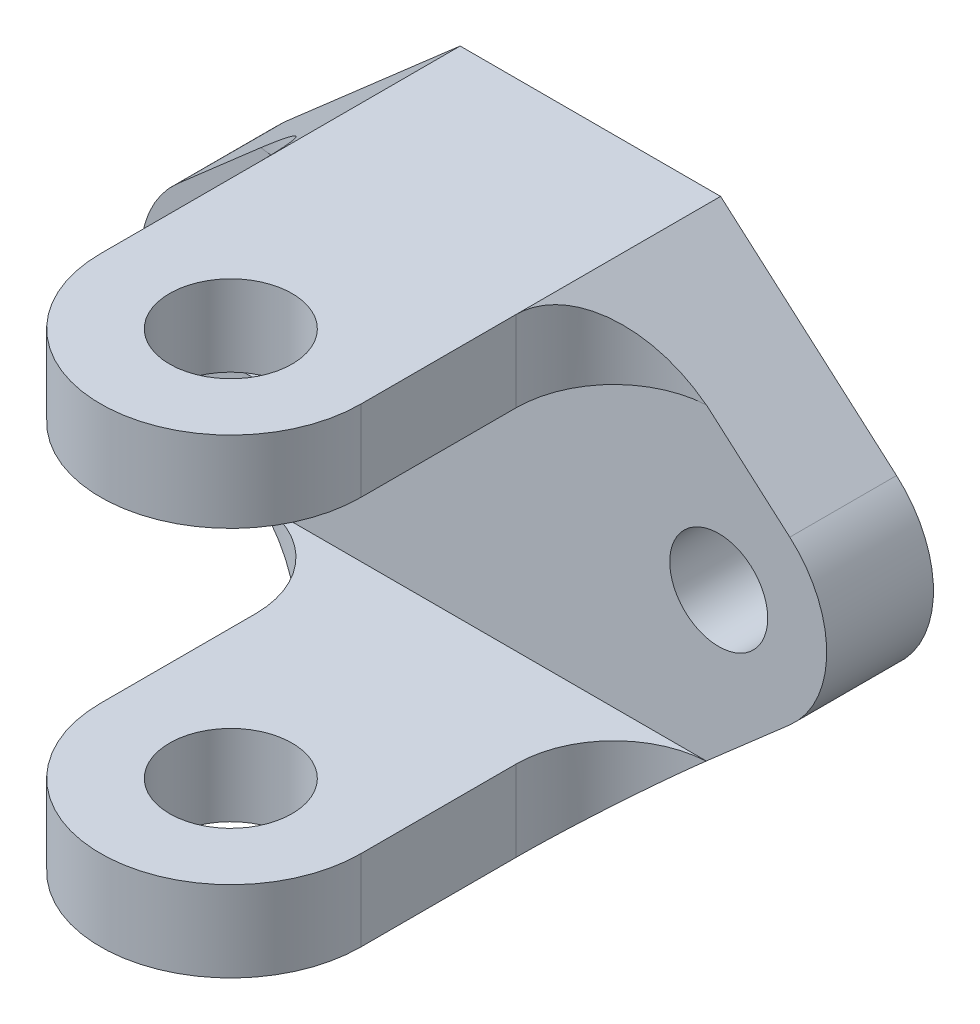
ISO-10303-21;
HEADER;
FILE_DESCRIPTION(('STEP AP214'),'2;1');
FILE_NAME('part.step','',(''),(''),'','','');
FILE_SCHEMA(('AUTOMOTIVE_DESIGN { 1 0 10303 214 1 1 1 1 }'));
ENDSEC;
DATA;
#1=APPLICATION_CONTEXT('core data for automotive mechanical design processes');
#2=APPLICATION_PROTOCOL_DEFINITION('international standard','automotive_design',2000,#1);
#3=PRODUCT_CONTEXT('',#1,'mechanical');
#4=PRODUCT('Part','Part','',(#3));
#5=PRODUCT_RELATED_PRODUCT_CATEGORY('part','',(#4));
#6=PRODUCT_DEFINITION_FORMATION('','',#4);
#7=PRODUCT_DEFINITION_CONTEXT('part definition',#1,'design');
#8=PRODUCT_DEFINITION('design','',#6,#7);
#9=PRODUCT_DEFINITION_SHAPE('','',#8);
#10=(LENGTH_UNIT() NAMED_UNIT(*) SI_UNIT(.MILLI.,.METRE.));
#11=(NAMED_UNIT(*) PLANE_ANGLE_UNIT() SI_UNIT($,.RADIAN.));
#12=(NAMED_UNIT(*) SI_UNIT($,.STERADIAN.) SOLID_ANGLE_UNIT());
#13=UNCERTAINTY_MEASURE_WITH_UNIT(LENGTH_MEASURE(1.E-05),#10,'distance_accuracy_value','');
#14=(GEOMETRIC_REPRESENTATION_CONTEXT(3) GLOBAL_UNCERTAINTY_ASSIGNED_CONTEXT((#13)) GLOBAL_UNIT_ASSIGNED_CONTEXT((#10,
#11,#12)) REPRESENTATION_CONTEXT('',''));
#15=CARTESIAN_POINT('',(0.,0.,0.));
#16=DIRECTION('',(0.,0.,1.));
#17=DIRECTION('',(1.,0.,0.));
#18=AXIS2_PLACEMENT_3D('',#15,#16,#17);
#19=CARTESIAN_POINT('',(-8.4418692,-85.7339032824825,0.));
#20=DIRECTION('',(1.,0.,0.));
#21=DIRECTION('',(0.,0.,-1.));
#22=AXIS2_PLACEMENT_3D('',#19,#20,#21);
#23=PLANE('',#22);
#24=DIRECTION('',(0.,0.,1.));
#25=VECTOR('',#24,1.);
#26=CARTESIAN_POINT('',(-8.4418692,15.24,0.));
#27=LINE('',#26,#25);
#28=CARTESIAN_POINT('',(-8.4418692,15.24,15.81));
#29=VERTEX_POINT('',#28);
#30=CARTESIAN_POINT('',(-8.4418692,15.24,25.8481308));
#31=VERTEX_POINT('',#30);
#32=EDGE_CURVE('E194',#29,#31,#27,.T.);
#33=ORIENTED_EDGE('',*,*,#32,.F.);
#34=DIRECTION('',(0.,1.,0.));
#35=VECTOR('',#34,1.);
#36=CARTESIAN_POINT('',(-8.4418692,9.99999999999999,15.81));
#37=LINE('',#36,#35);
#38=CARTESIAN_POINT('',(-8.4418692,10.,15.81));
#39=VERTEX_POINT('',#38);
#40=EDGE_CURVE('E285',#29,#39,#37,.F.);
#41=ORIENTED_EDGE('',*,*,#40,.T.);
#42=DIRECTION('',(0.,0.,-1.));
#43=VECTOR('',#42,1.);
#44=CARTESIAN_POINT('',(-8.4418692,10.,62.46));
#45=LINE('',#44,#43);
#46=CARTESIAN_POINT('',(-8.4418692,9.99999999999999,25.8481308));
#47=VERTEX_POINT('',#46);
#48=EDGE_CURVE('E230',#47,#39,#45,.T.);
#49=ORIENTED_EDGE('',*,*,#48,.F.);
#50=DIRECTION('',(0.,1.,0.));
#51=VECTOR('',#50,1.);
#52=CARTESIAN_POINT('',(-8.4418692,-85.7339032824825,25.8481308));
#53=LINE('',#52,#51);
#54=EDGE_CURVE('E208',#47,#31,#53,.T.);
#55=ORIENTED_EDGE('',*,*,#54,.T.);
#56=EDGE_LOOP('',(#33,#41,#49,#55));
#57=FACE_BOUND('',#56,.T.);
#58=ADVANCED_FACE('F43',(#57),#23,.F.);
#59=CARTESIAN_POINT('',(8.4418692,-85.7339032824825,0.));
#60=DIRECTION('',(1.,0.,0.));
#61=DIRECTION('',(0.,0.,-1.));
#62=AXIS2_PLACEMENT_3D('',#59,#60,#61);
#63=PLANE('',#62);
#64=DIRECTION('',(0.,0.,-1.));
#65=VECTOR('',#64,1.);
#66=CARTESIAN_POINT('',(8.44186919999999,10.,62.46));
#67=LINE('',#66,#65);
#68=CARTESIAN_POINT('',(8.4418692,9.99999999999999,25.8481308));
#69=VERTEX_POINT('',#68);
#70=CARTESIAN_POINT('',(8.4418692,10.,15.81));
#71=VERTEX_POINT('',#70);
#72=EDGE_CURVE('E234',#69,#71,#67,.T.);
#73=ORIENTED_EDGE('',*,*,#72,.T.);
#74=DIRECTION('',(0.,1.,0.));
#75=VECTOR('',#74,1.);
#76=CARTESIAN_POINT('',(8.4418692,-85.7339032824825,15.81));
#77=LINE('',#76,#75);
#78=CARTESIAN_POINT('',(8.4418692,15.24,15.81));
#79=VERTEX_POINT('',#78);
#80=EDGE_CURVE('E293',#71,#79,#77,.T.);
#81=ORIENTED_EDGE('',*,*,#80,.T.);
#82=DIRECTION('',(0.,0.,1.));
#83=VECTOR('',#82,1.);
#84=CARTESIAN_POINT('',(8.4418692,15.24,0.));
#85=LINE('',#84,#83);
#86=CARTESIAN_POINT('',(8.4418692,15.24,25.8481308));
#87=VERTEX_POINT('',#86);
#88=EDGE_CURVE('E199',#79,#87,#85,.T.);
#89=ORIENTED_EDGE('',*,*,#88,.T.);
#90=DIRECTION('',(0.,1.,0.));
#91=VECTOR('',#90,1.);
#92=CARTESIAN_POINT('',(8.4418692,-85.7339032824825,25.8481308));
#93=LINE('',#92,#91);
#94=EDGE_CURVE('E222',#69,#87,#93,.T.);
#95=ORIENTED_EDGE('',*,*,#94,.F.);
#96=EDGE_LOOP('',(#73,#81,#89,#95));
#97=FACE_BOUND('',#96,.T.);
#98=ADVANCED_FACE('F366',(#97),#63,.T.);
#99=CARTESIAN_POINT('',(15.24,0.,43.3423711563094));
#100=DIRECTION('',(0.,0.,-1.));
#101=DIRECTION('',(-1.,0.,0.));
#102=AXIS2_PLACEMENT_3D('',#99,#100,#101);
#103=CYLINDRICAL_SURFACE('',#102,7.);
#104=CARTESIAN_POINT('',(15.24,0.,2.54));
#105=DIRECTION('',(0.,0.,1.));
#106=DIRECTION('',(1.,0.,0.));
#107=AXIS2_PLACEMENT_3D('',#104,#105,#106);
#108=CIRCLE('',#107,7.);
#109=CARTESIAN_POINT('',(19.8469823285526,-5.2702669595006,2.54));
#110=VERTEX_POINT('',#109);
#111=CARTESIAN_POINT('',(19.8469823285526,5.27026695950061,2.54));
#112=VERTEX_POINT('',#111);
#113=EDGE_CURVE('E448',#110,#112,#108,.T.);
#114=ORIENTED_EDGE('',*,*,#113,.T.);
#115=DIRECTION('',(0.,0.,-1.));
#116=VECTOR('',#115,1.);
#117=CARTESIAN_POINT('',(19.8469823285526,5.27026695950061,24.6083392612494));
#118=LINE('',#117,#116);
#119=CARTESIAN_POINT('',(19.8469823285526,5.27026695950061,9.46));
#120=VERTEX_POINT('',#119);
#121=EDGE_CURVE('E428',#120,#112,#118,.T.);
#122=ORIENTED_EDGE('',*,*,#121,.F.);
#123=CARTESIAN_POINT('',(15.24,0.,9.46));
#124=DIRECTION('',(0.,0.,-1.));
#125=DIRECTION('',(-1.,0.,0.));
#126=AXIS2_PLACEMENT_3D('',#123,#124,#125);
#127=CIRCLE('',#126,7.);
#128=CARTESIAN_POINT('',(19.8469823285526,-5.27026695950061,9.46));
#129=VERTEX_POINT('',#128);
#130=EDGE_CURVE('E203',#129,#120,#127,.F.);
#131=ORIENTED_EDGE('',*,*,#130,.F.);
#132=DIRECTION('',(0.,0.,-1.));
#133=VECTOR('',#132,1.);
#134=CARTESIAN_POINT('',(19.8469823285526,-5.2702669595006,24.6083392612494));
#135=LINE('',#134,#133);
#136=EDGE_CURVE('E432',#129,#110,#135,.T.);
#137=ORIENTED_EDGE('',*,*,#136,.T.);
#138=EDGE_LOOP('',(#114,#122,#131,#137));
#139=FACE_BOUND('',#138,.T.);
#140=ADVANCED_FACE('F393',(#139),#103,.T.);
#141=DIRECTION('',(0.,0.,1.));
#142=VECTOR('',#141,1.);
#143=CARTESIAN_POINT('',(-8.4418692,-10.,62.46));
#144=LINE('',#143,#142);
#145=CARTESIAN_POINT('',(-8.4418692,-10.,15.81));
#146=VERTEX_POINT('',#145);
#147=CARTESIAN_POINT('',(-8.4418692,-10.,25.8481308));
#148=VERTEX_POINT('',#147);
#149=EDGE_CURVE('E268',#146,#148,#144,.T.);
#150=ORIENTED_EDGE('',*,*,#149,.F.);
#151=DIRECTION('',(0.,-1.,0.));
#152=VECTOR('',#151,1.);
#153=CARTESIAN_POINT('',(-8.4418692,-15.24,15.81));
#154=LINE('',#153,#152);
#155=CARTESIAN_POINT('',(-8.4418692,-15.24,15.81));
#156=VERTEX_POINT('',#155);
#157=EDGE_CURVE('E281',#146,#156,#154,.T.);
#158=ORIENTED_EDGE('',*,*,#157,.T.);
#159=DIRECTION('',(0.,0.,1.));
#160=VECTOR('',#159,1.);
#161=CARTESIAN_POINT('',(-8.4418692,-15.24,0.));
#162=LINE('',#161,#160);
#163=CARTESIAN_POINT('',(-8.4418692,-15.24,25.8481308));
#164=VERTEX_POINT('',#163);
#165=EDGE_CURVE('E217',#156,#164,#162,.T.);
#166=ORIENTED_EDGE('',*,*,#165,.T.);
#167=EDGE_CURVE('E223',#164,#148,#53,.T.);
#168=ORIENTED_EDGE('',*,*,#167,.T.);
#169=EDGE_LOOP('',(#150,#158,#166,#168));
#170=FACE_BOUND('',#169,.T.);
#171=ADVANCED_FACE('F389',(#170),#23,.F.);
#172=CARTESIAN_POINT('',(-15.24,0.,43.3423711563094));
#173=DIRECTION('',(0.,0.,-1.));
#174=DIRECTION('',(-1.,0.,0.));
#175=AXIS2_PLACEMENT_3D('',#172,#173,#174);
#176=CYLINDRICAL_SURFACE('',#175,7.);
#177=DIRECTION('',(0.,0.,-1.));
#178=VECTOR('',#177,1.);
#179=CARTESIAN_POINT('',(-19.8469823285526,5.2702669595006,24.6083392612494));
#180=LINE('',#179,#178);
#181=CARTESIAN_POINT('',(-19.8469823285526,5.27026695950061,9.46));
#182=VERTEX_POINT('',#181);
#183=CARTESIAN_POINT('',(-19.8469823285526,5.2702669595006,2.54));
#184=VERTEX_POINT('',#183);
#185=EDGE_CURVE('E452',#182,#184,#180,.T.);
#186=ORIENTED_EDGE('',*,*,#185,.T.);
#187=CARTESIAN_POINT('',(-15.24,0.,2.54));
#188=DIRECTION('',(0.,0.,1.));
#189=DIRECTION('',(1.,0.,0.));
#190=AXIS2_PLACEMENT_3D('',#187,#188,#189);
#191=CIRCLE('',#190,7.);
#192=CARTESIAN_POINT('',(-19.8469823285526,-5.2702669595006,2.54));
#193=VERTEX_POINT('',#192);
#194=EDGE_CURVE('E59',#184,#193,#191,.T.);
#195=ORIENTED_EDGE('',*,*,#194,.T.);
#196=DIRECTION('',(0.,0.,-1.));
#197=VECTOR('',#196,1.);
#198=CARTESIAN_POINT('',(-19.8469823285526,-5.27026695950061,24.6083392612494));
#199=LINE('',#198,#197);
#200=CARTESIAN_POINT('',(-19.8469823285526,-5.27026695950061,9.46));
#201=VERTEX_POINT('',#200);
#202=EDGE_CURVE('E427',#201,#193,#199,.T.);
#203=ORIENTED_EDGE('',*,*,#202,.F.);
#204=CARTESIAN_POINT('',(-15.24,0.,9.46));
#205=DIRECTION('',(0.,0.,-1.));
#206=DIRECTION('',(-1.,0.,0.));
#207=AXIS2_PLACEMENT_3D('',#204,#205,#206);
#208=CIRCLE('',#207,7.);
#209=EDGE_CURVE('E201',#201,#182,#208,.T.);
#210=ORIENTED_EDGE('',*,*,#209,.T.);
#211=EDGE_LOOP('',(#186,#195,#203,#210));
#212=FACE_BOUND('',#211,.T.);
#213=ADVANCED_FACE('F397',(#212),#176,.T.);
#214=DIRECTION('',(0.,0.,1.));
#215=VECTOR('',#214,1.);
#216=CARTESIAN_POINT('',(8.4418692,-15.24,0.));
#217=LINE('',#216,#215);
#218=CARTESIAN_POINT('',(8.4418692,-15.24,15.81));
#219=VERTEX_POINT('',#218);
#220=CARTESIAN_POINT('',(8.4418692,-15.24,25.8481308));
#221=VERTEX_POINT('',#220);
#222=EDGE_CURVE('E213',#219,#221,#217,.T.);
#223=ORIENTED_EDGE('',*,*,#222,.F.);
#224=DIRECTION('',(0.,-1.,0.));
#225=VECTOR('',#224,1.);
#226=CARTESIAN_POINT('',(8.4418692,-85.7339032824825,15.81));
#227=LINE('',#226,#225);
#228=CARTESIAN_POINT('',(8.4418692,-9.99999999999999,15.81));
#229=VERTEX_POINT('',#228);
#230=EDGE_CURVE('E289',#219,#229,#227,.F.);
#231=ORIENTED_EDGE('',*,*,#230,.T.);
#232=DIRECTION('',(0.,0.,1.));
#233=VECTOR('',#232,1.);
#234=CARTESIAN_POINT('',(8.44186919999999,-9.99999999999999,62.46));
#235=LINE('',#234,#233);
#236=CARTESIAN_POINT('',(8.4418692,-9.99999999999999,25.8481308));
#237=VERTEX_POINT('',#236);
#238=EDGE_CURVE('E278',#229,#237,#235,.T.);
#239=ORIENTED_EDGE('',*,*,#238,.T.);
#240=EDGE_CURVE('E218',#221,#237,#93,.T.);
#241=ORIENTED_EDGE('',*,*,#240,.F.);
#242=EDGE_LOOP('',(#223,#231,#239,#241));
#243=FACE_BOUND('',#242,.T.);
#244=ADVANCED_FACE('F343',(#243),#63,.T.);
#245=CARTESIAN_POINT('',(-23.24,10.,62.46));
#246=DIRECTION('',(0.,1.,0.));
#247=DIRECTION('',(0.,0.,1.));
#248=AXIS2_PLACEMENT_3D('',#245,#246,#247);
#249=PLANE('',#248);
#250=CARTESIAN_POINT('',(0.,10.,25.8481308));
#251=DIRECTION('',(0.,1.,0.));
#252=DIRECTION('',(0.,0.,1.));
#253=AXIS2_PLACEMENT_3D('',#250,#251,#252);
#254=CIRCLE('',#253,3.96875);
#255=CARTESIAN_POINT('',(0.,9.99999999999999,29.8168808));
#256=VERTEX_POINT('',#255);
#257=EDGE_CURVE('E250',#256,#256,#254,.T.);
#258=ORIENTED_EDGE('',*,*,#257,.T.);
#259=EDGE_LOOP('',(#258));
#260=FACE_BOUND('',#259,.T.);
#261=ORIENTED_EDGE('',*,*,#72,.F.);
#262=CARTESIAN_POINT('',(0.,9.99999999999999,25.8481308));
#263=DIRECTION('',(0.,1.,0.));
#264=DIRECTION('',(0.,0.,1.));
#265=AXIS2_PLACEMENT_3D('',#262,#263,#264);
#266=CIRCLE('',#265,8.4418692);
#267=EDGE_CURVE('E238',#47,#69,#266,.T.);
#268=ORIENTED_EDGE('',*,*,#267,.F.);
#269=ORIENTED_EDGE('',*,*,#48,.T.);
#270=CARTESIAN_POINT('',(-14.7918692,10.,15.81));
#271=DIRECTION('',(0.,1.,0.));
#272=DIRECTION('',(0.,0.,1.));
#273=AXIS2_PLACEMENT_3D('',#270,#271,#272);
#274=CIRCLE('',#273,6.35);
#275=CARTESIAN_POINT('',(-14.4362917738889,10.,9.46996335231095));
#276=VERTEX_POINT('',#275);
#277=EDGE_CURVE('E305',#39,#276,#274,.T.);
#278=ORIENTED_EDGE('',*,*,#277,.T.);
#279=DIRECTION('',(0.,0.,1.));
#280=VECTOR('',#279,1.);
#281=CARTESIAN_POINT('',(-14.4362917738889,10.,24.6083392612494));
#282=LINE('',#281,#280);
#283=CARTESIAN_POINT('',(-14.4362917738889,10.,9.46));
#284=VERTEX_POINT('',#283);
#285=EDGE_CURVE('E320',#284,#276,#282,.T.);
#286=ORIENTED_EDGE('',*,*,#285,.F.);
#287=DIRECTION('',(1.,0.,0.));
#288=VECTOR('',#287,1.);
#289=CARTESIAN_POINT('',(-23.24,10.,9.46));
#290=LINE('',#289,#288);
#291=CARTESIAN_POINT('',(14.4362917738889,10.,9.46));
#292=VERTEX_POINT('',#291);
#293=EDGE_CURVE('E257',#284,#292,#290,.T.);
#294=ORIENTED_EDGE('',*,*,#293,.T.);
#295=DIRECTION('',(0.,0.,-1.));
#296=VECTOR('',#295,1.);
#297=CARTESIAN_POINT('',(14.4362917738889,10.,62.46));
#298=LINE('',#297,#296);
#299=CARTESIAN_POINT('',(14.4362917738889,9.99999999999999,9.46996335231095));
#300=VERTEX_POINT('',#299);
#301=EDGE_CURVE('E11',#292,#300,#298,.F.);
#302=ORIENTED_EDGE('',*,*,#301,.T.);
#303=CARTESIAN_POINT('',(14.7918692,9.99999999999999,15.81));
#304=DIRECTION('',(0.,1.,0.));
#305=DIRECTION('',(0.,0.,1.));
#306=AXIS2_PLACEMENT_3D('',#303,#304,#305);
#307=CIRCLE('',#306,6.35);
#308=EDGE_CURVE('E317',#300,#71,#307,.T.);
#309=ORIENTED_EDGE('',*,*,#308,.T.);
#310=EDGE_LOOP('',(#261,#268,#269,#278,#286,#294,#302,#309));
#311=FACE_BOUND('',#310,.T.);
#312=ADVANCED_FACE('F376',(#260,#311),#249,.F.);
#313=CARTESIAN_POINT('',(-23.24,-10.,62.46));
#314=DIRECTION('',(0.,-1.,0.));
#315=DIRECTION('',(1.,0.,0.));
#316=AXIS2_PLACEMENT_3D('',#313,#314,#315);
#317=PLANE('',#316);
#318=CARTESIAN_POINT('',(0.,-9.99999999999999,25.8481308));
#319=DIRECTION('',(0.,-1.,0.));
#320=DIRECTION('',(1.,0.,0.));
#321=AXIS2_PLACEMENT_3D('',#318,#319,#320);
#322=CIRCLE('',#321,3.96875);
#323=CARTESIAN_POINT('',(0.,-9.99999999999999,29.8168808));
#324=VERTEX_POINT('',#323);
#325=EDGE_CURVE('E249',#324,#324,#322,.T.);
#326=ORIENTED_EDGE('',*,*,#325,.T.);
#327=EDGE_LOOP('',(#326));
#328=FACE_BOUND('',#327,.T.);
#329=ORIENTED_EDGE('',*,*,#238,.F.);
#330=CARTESIAN_POINT('',(14.7918692,-9.99999999999999,15.81));
#331=DIRECTION('',(0.,-1.,0.));
#332=DIRECTION('',(1.,0.,0.));
#333=AXIS2_PLACEMENT_3D('',#330,#331,#332);
#334=CIRCLE('',#333,6.35);
#335=CARTESIAN_POINT('',(14.4362917738889,-9.99999999999999,9.46996335231095));
#336=VERTEX_POINT('',#335);
#337=EDGE_CURVE('E312',#229,#336,#334,.T.);
#338=ORIENTED_EDGE('',*,*,#337,.T.);
#339=DIRECTION('',(0.,0.,1.));
#340=VECTOR('',#339,1.);
#341=CARTESIAN_POINT('',(14.4362917738889,-9.99999999999999,24.6083392612494));
#342=LINE('',#341,#340);
#343=CARTESIAN_POINT('',(14.4362917738889,-9.99999999999999,9.46));
#344=VERTEX_POINT('',#343);
#345=EDGE_CURVE('E324',#344,#336,#342,.T.);
#346=ORIENTED_EDGE('',*,*,#345,.F.);
#347=DIRECTION('',(-1.,0.,0.));
#348=VECTOR('',#347,1.);
#349=CARTESIAN_POINT('',(-23.24,-10.,9.46));
#350=LINE('',#349,#348);
#351=CARTESIAN_POINT('',(-14.4362917738889,-10.,9.46));
#352=VERTEX_POINT('',#351);
#353=EDGE_CURVE('E254',#344,#352,#350,.T.);
#354=ORIENTED_EDGE('',*,*,#353,.T.);
#355=DIRECTION('',(0.,0.,-1.));
#356=VECTOR('',#355,1.);
#357=CARTESIAN_POINT('',(-14.4362917738889,-10.,62.46));
#358=LINE('',#357,#356);
#359=CARTESIAN_POINT('',(-14.4362917738889,-10.,9.46996335231095));
#360=VERTEX_POINT('',#359);
#361=EDGE_CURVE('E52',#352,#360,#358,.F.);
#362=ORIENTED_EDGE('',*,*,#361,.T.);
#363=CARTESIAN_POINT('',(-14.7918692,-10.,15.81));
#364=DIRECTION('',(0.,-1.,0.));
#365=DIRECTION('',(1.,0.,0.));
#366=AXIS2_PLACEMENT_3D('',#363,#364,#365);
#367=CIRCLE('',#366,6.35);
#368=EDGE_CURVE('E300',#360,#146,#367,.T.);
#369=ORIENTED_EDGE('',*,*,#368,.T.);
#370=ORIENTED_EDGE('',*,*,#149,.T.);
#371=CARTESIAN_POINT('',(0.,-9.99999999999999,25.8481308));
#372=DIRECTION('',(0.,-1.,0.));
#373=DIRECTION('',(1.,0.,0.));
#374=AXIS2_PLACEMENT_3D('',#371,#372,#373);
#375=CIRCLE('',#374,8.4418692);
#376=EDGE_CURVE('E274',#237,#148,#375,.T.);
#377=ORIENTED_EDGE('',*,*,#376,.F.);
#378=EDGE_LOOP('',(#329,#338,#346,#354,#362,#369,#370,#377));
#379=FACE_BOUND('',#378,.T.);
#380=ADVANCED_FACE('F346',(#328,#379),#317,.F.);
#381=CARTESIAN_POINT('',(0.,0.,9.46));
#382=DIRECTION('',(0.,0.,-1.));
#383=DIRECTION('',(-1.,0.,0.));
#384=AXIS2_PLACEMENT_3D('',#381,#382,#383);
#385=PLANE('',#384);
#386=DIRECTION('',(0.752895279928659,-0.658140332650375,0.));
#387=VECTOR('',#386,1.);
#388=CARTESIAN_POINT('',(-11.2081684778605,-12.8218507892437,9.46));
#389=LINE('',#388,#387);
#390=EDGE_CURVE('E423',#201,#352,#389,.T.);
#391=ORIENTED_EDGE('',*,*,#390,.T.);
#392=ORIENTED_EDGE('',*,*,#353,.F.);
#393=DIRECTION('',(-0.752895279928658,-0.658140332650376,0.));
#394=VECTOR('',#393,1.);
#395=CARTESIAN_POINT('',(11.2081684778605,-12.8218507892437,9.46));
#396=LINE('',#395,#394);
#397=EDGE_CURVE('E336',#129,#344,#396,.T.);
#398=ORIENTED_EDGE('',*,*,#397,.F.);
#399=ORIENTED_EDGE('',*,*,#130,.T.);
#400=DIRECTION('',(-0.752895279928659,0.658140332650375,0.));
#401=VECTOR('',#400,1.);
#402=CARTESIAN_POINT('',(8.4418692,15.24,9.46));
#403=LINE('',#402,#401);
#404=EDGE_CURVE('E435',#120,#292,#403,.T.);
#405=ORIENTED_EDGE('',*,*,#404,.T.);
#406=ORIENTED_EDGE('',*,*,#293,.F.);
#407=DIRECTION('',(0.752895279928658,0.658140332650376,0.));
#408=VECTOR('',#407,1.);
#409=CARTESIAN_POINT('',(-8.4418692,15.24,9.46));
#410=LINE('',#409,#408);
#411=EDGE_CURVE('E455',#182,#284,#410,.T.);
#412=ORIENTED_EDGE('',*,*,#411,.F.);
#413=ORIENTED_EDGE('',*,*,#209,.F.);
#414=EDGE_LOOP('',(#391,#392,#398,#399,#405,#406,#412,#413));
#415=FACE_BOUND('',#414,.T.);
#416=CARTESIAN_POINT('',(15.24,0.,9.46));
#417=DIRECTION('',(0.,0.,1.));
#418=DIRECTION('',(1.,0.,0.));
#419=AXIS2_PLACEMENT_3D('',#416,#417,#418);
#420=CIRCLE('',#419,3.175);
#421=CARTESIAN_POINT('',(18.415,0.,9.46));
#422=VERTEX_POINT('',#421);
#423=EDGE_CURVE('E264',#422,#422,#420,.T.);
#424=ORIENTED_EDGE('',*,*,#423,.F.);
#425=EDGE_LOOP('',(#424));
#426=FACE_BOUND('',#425,.T.);
#427=CARTESIAN_POINT('',(-15.24,0.,9.46));
#428=DIRECTION('',(0.,0.,1.));
#429=DIRECTION('',(1.,0.,0.));
#430=AXIS2_PLACEMENT_3D('',#427,#428,#429);
#431=CIRCLE('',#430,3.175);
#432=CARTESIAN_POINT('',(-12.065,0.,9.46));
#433=VERTEX_POINT('',#432);
#434=EDGE_CURVE('E260',#433,#433,#431,.T.);
#435=ORIENTED_EDGE('',*,*,#434,.F.);
#436=EDGE_LOOP('',(#435));
#437=FACE_BOUND('',#436,.T.);
#438=ADVANCED_FACE('F419',(#415,#426,#437),#385,.F.);
#439=CARTESIAN_POINT('',(-23.24,15.24,9.46));
#440=DIRECTION('',(0.,-1.,0.));
#441=DIRECTION('',(0.,0.,-1.));
#442=AXIS2_PLACEMENT_3D('',#439,#440,#441);
#443=PLANE('',#442);
#444=CARTESIAN_POINT('',(0.,15.24,25.8481308));
#445=DIRECTION('',(0.,-1.,0.));
#446=DIRECTION('',(0.,0.,-1.));
#447=AXIS2_PLACEMENT_3D('',#444,#445,#446);
#448=CIRCLE('',#447,3.96875);
#449=CARTESIAN_POINT('',(0.,15.24,29.8168808));
#450=VERTEX_POINT('',#449);
#451=EDGE_CURVE('E241',#450,#450,#448,.T.);
#452=ORIENTED_EDGE('',*,*,#451,.T.);
#453=EDGE_LOOP('',(#452));
#454=FACE_BOUND('',#453,.T.);
#455=CARTESIAN_POINT('',(8.4418692,15.24,2.54));
#456=VERTEX_POINT('',#455);
#457=EDGE_CURVE('E183',#456,#79,#85,.T.);
#458=ORIENTED_EDGE('',*,*,#457,.F.);
#459=DIRECTION('',(-1.,0.,0.));
#460=VECTOR('',#459,1.);
#461=CARTESIAN_POINT('',(8.4418692,15.24,2.54));
#462=LINE('',#461,#460);
#463=CARTESIAN_POINT('',(-8.4418692,15.24,2.54));
#464=VERTEX_POINT('',#463);
#465=EDGE_CURVE('E169',#456,#464,#462,.T.);
#466=ORIENTED_EDGE('',*,*,#465,.T.);
#467=EDGE_CURVE('E180',#464,#29,#27,.T.);
#468=ORIENTED_EDGE('',*,*,#467,.T.);
#469=ORIENTED_EDGE('',*,*,#32,.T.);
#470=CARTESIAN_POINT('',(0.,15.24,25.8481308));
#471=DIRECTION('',(0.,-1.,0.));
#472=DIRECTION('',(0.,0.,-1.));
#473=AXIS2_PLACEMENT_3D('',#470,#471,#472);
#474=CIRCLE('',#473,8.4418692);
#475=EDGE_CURVE('E193',#87,#31,#474,.T.);
#476=ORIENTED_EDGE('',*,*,#475,.F.);
#477=ORIENTED_EDGE('',*,*,#88,.F.);
#478=EDGE_LOOP('',(#458,#466,#468,#469,#476,#477));
#479=FACE_BOUND('',#478,.T.);
#480=ADVANCED_FACE('F179',(#454,#479),#443,.F.);
#481=CARTESIAN_POINT('',(-23.24,-15.24,9.46));
#482=DIRECTION('',(0.,1.,0.));
#483=DIRECTION('',(0.,0.,1.));
#484=AXIS2_PLACEMENT_3D('',#481,#482,#483);
#485=PLANE('',#484);
#486=CARTESIAN_POINT('',(-8.4418692,-15.24,2.54));
#487=VERTEX_POINT('',#486);
#488=EDGE_CURVE('E227',#487,#156,#162,.T.);
#489=ORIENTED_EDGE('',*,*,#488,.F.);
#490=DIRECTION('',(1.,0.,0.));
#491=VECTOR('',#490,1.);
#492=CARTESIAN_POINT('',(-8.4418692,-15.24,2.54));
#493=LINE('',#492,#491);
#494=CARTESIAN_POINT('',(8.4418692,-15.24,2.54));
#495=VERTEX_POINT('',#494);
#496=EDGE_CURVE('E477',#487,#495,#493,.T.);
#497=ORIENTED_EDGE('',*,*,#496,.T.);
#498=EDGE_CURVE('E209',#495,#219,#217,.T.);
#499=ORIENTED_EDGE('',*,*,#498,.T.);
#500=ORIENTED_EDGE('',*,*,#222,.T.);
#501=CARTESIAN_POINT('',(0.,-15.24,25.8481308));
#502=DIRECTION('',(0.,1.,0.));
#503=DIRECTION('',(0.,0.,1.));
#504=AXIS2_PLACEMENT_3D('',#501,#502,#503);
#505=CIRCLE('',#504,8.4418692);
#506=EDGE_CURVE('E212',#221,#164,#505,.F.);
#507=ORIENTED_EDGE('',*,*,#506,.T.);
#508=ORIENTED_EDGE('',*,*,#165,.F.);
#509=EDGE_LOOP('',(#489,#497,#499,#500,#507,#508));
#510=FACE_BOUND('',#509,.T.);
#511=CARTESIAN_POINT('',(0.,-15.24,25.8481308));
#512=DIRECTION('',(0.,1.,0.));
#513=DIRECTION('',(0.,0.,1.));
#514=AXIS2_PLACEMENT_3D('',#511,#512,#513);
#515=CIRCLE('',#514,3.96875);
#516=CARTESIAN_POINT('',(0.,-15.24,29.8168808));
#517=VERTEX_POINT('',#516);
#518=EDGE_CURVE('E245',#517,#517,#515,.F.);
#519=ORIENTED_EDGE('',*,*,#518,.F.);
#520=EDGE_LOOP('',(#519));
#521=FACE_BOUND('',#520,.T.);
#522=ADVANCED_FACE('F355',(#510,#521),#485,.F.);
#523=CARTESIAN_POINT('',(15.24,0.,9.46));
#524=DIRECTION('',(0.,0.,-1.));
#525=DIRECTION('',(-1.,0.,0.));
#526=AXIS2_PLACEMENT_3D('',#523,#524,#525);
#527=CYLINDRICAL_SURFACE('',#526,3.175);
#528=CARTESIAN_POINT('',(15.24,0.,2.54));
#529=DIRECTION('',(0.,0.,1.));
#530=DIRECTION('',(1.,0.,0.));
#531=AXIS2_PLACEMENT_3D('',#528,#529,#530);
#532=CIRCLE('',#531,3.175);
#533=CARTESIAN_POINT('',(18.415,0.,2.54));
#534=VERTEX_POINT('',#533);
#535=EDGE_CURVE('E460',#534,#534,#532,.T.);
#536=ORIENTED_EDGE('',*,*,#535,.F.);
#537=EDGE_LOOP('',(#536));
#538=FACE_BOUND('',#537,.T.);
#539=ORIENTED_EDGE('',*,*,#423,.T.);
#540=EDGE_LOOP('',(#539));
#541=FACE_BOUND('',#540,.T.);
#542=ADVANCED_FACE('F498',(#538,#541),#527,.F.);
#543=CARTESIAN_POINT('',(-15.24,0.,9.46));
#544=DIRECTION('',(0.,0.,-1.));
#545=DIRECTION('',(-1.,0.,0.));
#546=AXIS2_PLACEMENT_3D('',#543,#544,#545);
#547=CYLINDRICAL_SURFACE('',#546,3.175);
#548=CARTESIAN_POINT('',(-15.24,0.,2.54));
#549=DIRECTION('',(0.,0.,1.));
#550=DIRECTION('',(1.,0.,0.));
#551=AXIS2_PLACEMENT_3D('',#548,#549,#550);
#552=CIRCLE('',#551,3.175);
#553=CARTESIAN_POINT('',(-12.065,0.,2.54));
#554=VERTEX_POINT('',#553);
#555=EDGE_CURVE('E465',#554,#554,#552,.T.);
#556=ORIENTED_EDGE('',*,*,#555,.F.);
#557=EDGE_LOOP('',(#556));
#558=FACE_BOUND('',#557,.T.);
#559=ORIENTED_EDGE('',*,*,#434,.T.);
#560=EDGE_LOOP('',(#559));
#561=FACE_BOUND('',#560,.T.);
#562=ADVANCED_FACE('F503',(#558,#561),#547,.F.);
#563=CARTESIAN_POINT('',(0.,-26.4653201513364,25.8481308));
#564=DIRECTION('',(0.,1.,0.));
#565=DIRECTION('',(0.,0.,1.));
#566=AXIS2_PLACEMENT_3D('',#563,#564,#565);
#567=CYLINDRICAL_SURFACE('',#566,3.96875);
#568=CARTESIAN_POINT('',(0.,-15.24,29.8168808));
#569=CARTESIAN_POINT('',(0.,-15.1854166666667,29.8168808));
#570=CARTESIAN_POINT('',(0.,-15.1308333333333,29.8168808));
#571=CARTESIAN_POINT('',(0.,-15.0216666666667,29.8168808));
#572=CARTESIAN_POINT('',(0.,-14.9670833333333,29.8168808));
#573=CARTESIAN_POINT('',(0.,-14.8579166666667,29.8168808));
#574=CARTESIAN_POINT('',(0.,-14.8033333333333,29.8168808));
#575=CARTESIAN_POINT('',(0.,-14.6941666666667,29.8168808));
#576=CARTESIAN_POINT('',(0.,-14.6395833333333,29.8168808));
#577=CARTESIAN_POINT('',(0.,-14.5304166666667,29.8168808));
#578=CARTESIAN_POINT('',(0.,-14.4758333333333,29.8168808));
#579=CARTESIAN_POINT('',(0.,-14.3666666666667,29.8168808));
#580=CARTESIAN_POINT('',(0.,-14.3120833333333,29.8168808));
#581=CARTESIAN_POINT('',(0.,-14.2029166666667,29.8168808));
#582=CARTESIAN_POINT('',(0.,-14.1483333333333,29.8168808));
#583=CARTESIAN_POINT('',(0.,-14.0391666666667,29.8168808));
#584=CARTESIAN_POINT('',(0.,-13.9845833333333,29.8168808));
#585=CARTESIAN_POINT('',(0.,-13.8754166666667,29.8168808));
#586=CARTESIAN_POINT('',(0.,-13.8208333333333,29.8168808));
#587=CARTESIAN_POINT('',(0.,-13.7116666666667,29.8168808));
#588=CARTESIAN_POINT('',(0.,-13.6570833333333,29.8168808));
#589=CARTESIAN_POINT('',(0.,-13.5479166666667,29.8168808));
#590=CARTESIAN_POINT('',(0.,-13.4933333333333,29.8168808));
#591=CARTESIAN_POINT('',(0.,-13.3841666666667,29.8168808));
#592=CARTESIAN_POINT('',(0.,-13.3295833333333,29.8168808));
#593=CARTESIAN_POINT('',(0.,-13.2204166666667,29.8168808));
#594=CARTESIAN_POINT('',(0.,-13.1658333333333,29.8168808));
#595=CARTESIAN_POINT('',(0.,-13.0566666666667,29.8168808));
#596=CARTESIAN_POINT('',(0.,-13.0020833333333,29.8168808));
#597=CARTESIAN_POINT('',(0.,-12.8929166666667,29.8168808));
#598=CARTESIAN_POINT('',(0.,-12.8383333333333,29.8168808));
#599=CARTESIAN_POINT('',(0.,-12.7291666666667,29.8168808));
#600=CARTESIAN_POINT('',(0.,-12.6745833333333,29.8168808));
#601=CARTESIAN_POINT('',(0.,-12.5654166666667,29.8168808));
#602=CARTESIAN_POINT('',(0.,-12.5108333333333,29.8168808));
#603=CARTESIAN_POINT('',(0.,-12.4016666666667,29.8168808));
#604=CARTESIAN_POINT('',(0.,-12.3470833333333,29.8168808));
#605=CARTESIAN_POINT('',(0.,-12.2379166666667,29.8168808));
#606=CARTESIAN_POINT('',(0.,-12.1833333333333,29.8168808));
#607=CARTESIAN_POINT('',(0.,-12.0741666666667,29.8168808));
#608=CARTESIAN_POINT('',(0.,-12.0195833333333,29.8168808));
#609=CARTESIAN_POINT('',(0.,-11.9104166666667,29.8168808));
#610=CARTESIAN_POINT('',(0.,-11.8558333333333,29.8168808));
#611=CARTESIAN_POINT('',(0.,-11.7466666666667,29.8168808));
#612=CARTESIAN_POINT('',(0.,-11.6920833333333,29.8168808));
#613=CARTESIAN_POINT('',(0.,-11.5829166666667,29.8168808));
#614=CARTESIAN_POINT('',(0.,-11.5283333333333,29.8168808));
#615=CARTESIAN_POINT('',(0.,-11.4191666666667,29.8168808));
#616=CARTESIAN_POINT('',(0.,-11.3645833333333,29.8168808));
#617=CARTESIAN_POINT('',(0.,-11.2554166666667,29.8168808));
#618=CARTESIAN_POINT('',(0.,-11.2008333333333,29.8168808));
#619=CARTESIAN_POINT('',(0.,-11.0916666666667,29.8168808));
#620=CARTESIAN_POINT('',(0.,-11.0370833333333,29.8168808));
#621=CARTESIAN_POINT('',(0.,-10.9279166666667,29.8168808));
#622=CARTESIAN_POINT('',(0.,-10.8733333333333,29.8168808));
#623=CARTESIAN_POINT('',(0.,-10.7641666666667,29.8168808));
#624=CARTESIAN_POINT('',(0.,-10.7095833333333,29.8168808));
#625=CARTESIAN_POINT('',(0.,-10.6004166666667,29.8168808));
#626=CARTESIAN_POINT('',(0.,-10.5458333333333,29.8168808));
#627=CARTESIAN_POINT('',(0.,-10.4366666666667,29.8168808));
#628=CARTESIAN_POINT('',(0.,-10.3820833333333,29.8168808));
#629=CARTESIAN_POINT('',(0.,-10.2729166666667,29.8168808));
#630=CARTESIAN_POINT('',(0.,-10.2183333333333,29.8168808));
#631=CARTESIAN_POINT('',(0.,-10.1091666666667,29.8168808));
#632=CARTESIAN_POINT('',(0.,-10.0545833333333,29.8168808));
#633=CARTESIAN_POINT('',(0.,-9.99999999999999,29.8168808));
#634=B_SPLINE_CURVE_WITH_KNOTS('',3,(#568,#569,#570,#571,#572,#573,#574,#575,#576,#577,#578,
#579,#580,#581,#582,#583,#584,#585,#586,#587,#588,#589,#590,#591,#592,#593,#594,#595,#596,#597,
#598,#599,#600,#601,#602,#603,#604,#605,#606,#607,#608,#609,#610,#611,#612,#613,#614,#615,#616,
#617,#618,#619,#620,#621,#622,#623,#624,#625,#626,#627,#628,#629,#630,#631,#632,#633),
.UNSPECIFIED.,.F.,.F.,(4,2,2,2,2,2,2,2,2,2,2,2,2,2,2,2,2,2,2,2,2,2,2,2,2,2,2,2,2,2,2,2,4),(0.,
0.163750000000001,0.327500000000001,0.49125,0.655000000000001,0.818750000000002,
0.982500000000002,1.14625,1.31,1.47375,1.6375,1.80125,1.965,2.12875000000001,2.29250000000001,
2.45625000000001,2.62000000000001,2.78375000000001,2.94750000000001,3.11125000000001,
3.27500000000001,3.43875000000001,3.60250000000001,3.76625000000001,3.93000000000001,
4.09375000000001,4.25750000000001,4.42125000000001,4.58500000000001,4.74875000000001,
4.91250000000001,5.07625000000001,5.24000000000001),.UNSPECIFIED.);
#635=EDGE_CURVE('BSEAM507',#517,#324,#634,.T.);
#636=ORIENTED_EDGE('',*,*,#518,.T.);
#637=ORIENTED_EDGE('',*,*,#325,.F.);
#638=ORIENTED_EDGE('',*,*,#635,.T.);
#639=ORIENTED_EDGE('',*,*,#635,.F.);
#640=EDGE_LOOP('',(#636,#638,#637,#639));
#641=FACE_BOUND('',#640,.T.);
#642=ADVANCED_FACE('F507',(#641),#567,.F.);
#643=CARTESIAN_POINT('',(0.,15.24,29.8168808));
#644=CARTESIAN_POINT('',(0.,15.1854166666667,29.8168808));
#645=CARTESIAN_POINT('',(0.,15.1308333333333,29.8168808));
#646=CARTESIAN_POINT('',(0.,15.0216666666667,29.8168808));
#647=CARTESIAN_POINT('',(0.,14.9670833333333,29.8168808));
#648=CARTESIAN_POINT('',(0.,14.8579166666667,29.8168808));
#649=CARTESIAN_POINT('',(0.,14.8033333333333,29.8168808));
#650=CARTESIAN_POINT('',(0.,14.6941666666667,29.8168808));
#651=CARTESIAN_POINT('',(0.,14.6395833333333,29.8168808));
#652=CARTESIAN_POINT('',(0.,14.5304166666667,29.8168808));
#653=CARTESIAN_POINT('',(0.,14.4758333333333,29.8168808));
#654=CARTESIAN_POINT('',(0.,14.3666666666667,29.8168808));
#655=CARTESIAN_POINT('',(0.,14.3120833333333,29.8168808));
#656=CARTESIAN_POINT('',(0.,14.2029166666667,29.8168808));
#657=CARTESIAN_POINT('',(0.,14.1483333333333,29.8168808));
#658=CARTESIAN_POINT('',(0.,14.0391666666667,29.8168808));
#659=CARTESIAN_POINT('',(0.,13.9845833333333,29.8168808));
#660=CARTESIAN_POINT('',(0.,13.8754166666667,29.8168808));
#661=CARTESIAN_POINT('',(0.,13.8208333333333,29.8168808));
#662=CARTESIAN_POINT('',(0.,13.7116666666667,29.8168808));
#663=CARTESIAN_POINT('',(0.,13.6570833333333,29.8168808));
#664=CARTESIAN_POINT('',(0.,13.5479166666667,29.8168808));
#665=CARTESIAN_POINT('',(0.,13.4933333333333,29.8168808));
#666=CARTESIAN_POINT('',(0.,13.3841666666667,29.8168808));
#667=CARTESIAN_POINT('',(0.,13.3295833333333,29.8168808));
#668=CARTESIAN_POINT('',(0.,13.2204166666667,29.8168808));
#669=CARTESIAN_POINT('',(0.,13.1658333333333,29.8168808));
#670=CARTESIAN_POINT('',(0.,13.0566666666667,29.8168808));
#671=CARTESIAN_POINT('',(0.,13.0020833333333,29.8168808));
#672=CARTESIAN_POINT('',(0.,12.8929166666667,29.8168808));
#673=CARTESIAN_POINT('',(0.,12.8383333333333,29.8168808));
#674=CARTESIAN_POINT('',(0.,12.7291666666667,29.8168808));
#675=CARTESIAN_POINT('',(0.,12.6745833333333,29.8168808));
#676=CARTESIAN_POINT('',(0.,12.5654166666667,29.8168808));
#677=CARTESIAN_POINT('',(0.,12.5108333333333,29.8168808));
#678=CARTESIAN_POINT('',(0.,12.4016666666667,29.8168808));
#679=CARTESIAN_POINT('',(0.,12.3470833333333,29.8168808));
#680=CARTESIAN_POINT('',(0.,12.2379166666667,29.8168808));
#681=CARTESIAN_POINT('',(0.,12.1833333333333,29.8168808));
#682=CARTESIAN_POINT('',(0.,12.0741666666667,29.8168808));
#683=CARTESIAN_POINT('',(0.,12.0195833333333,29.8168808));
#684=CARTESIAN_POINT('',(0.,11.9104166666667,29.8168808));
#685=CARTESIAN_POINT('',(0.,11.8558333333333,29.8168808));
#686=CARTESIAN_POINT('',(0.,11.7466666666667,29.8168808));
#687=CARTESIAN_POINT('',(0.,11.6920833333333,29.8168808));
#688=CARTESIAN_POINT('',(0.,11.5829166666667,29.8168808));
#689=CARTESIAN_POINT('',(0.,11.5283333333333,29.8168808));
#690=CARTESIAN_POINT('',(0.,11.4191666666667,29.8168808));
#691=CARTESIAN_POINT('',(0.,11.3645833333333,29.8168808));
#692=CARTESIAN_POINT('',(0.,11.2554166666667,29.8168808));
#693=CARTESIAN_POINT('',(0.,11.2008333333333,29.8168808));
#694=CARTESIAN_POINT('',(0.,11.0916666666667,29.8168808));
#695=CARTESIAN_POINT('',(0.,11.0370833333333,29.8168808));
#696=CARTESIAN_POINT('',(0.,10.9279166666667,29.8168808));
#697=CARTESIAN_POINT('',(0.,10.8733333333333,29.8168808));
#698=CARTESIAN_POINT('',(0.,10.7641666666667,29.8168808));
#699=CARTESIAN_POINT('',(0.,10.7095833333333,29.8168808));
#700=CARTESIAN_POINT('',(0.,10.6004166666667,29.8168808));
#701=CARTESIAN_POINT('',(0.,10.5458333333333,29.8168808));
#702=CARTESIAN_POINT('',(0.,10.4366666666667,29.8168808));
#703=CARTESIAN_POINT('',(0.,10.3820833333333,29.8168808));
#704=CARTESIAN_POINT('',(0.,10.2729166666667,29.8168808));
#705=CARTESIAN_POINT('',(0.,10.2183333333333,29.8168808));
#706=CARTESIAN_POINT('',(0.,10.1091666666667,29.8168808));
#707=CARTESIAN_POINT('',(0.,10.0545833333333,29.8168808));
#708=CARTESIAN_POINT('',(0.,9.99999999999999,29.8168808));
#709=B_SPLINE_CURVE_WITH_KNOTS('',3,(#643,#644,#645,#646,#647,#648,#649,#650,#651,#652,#653,
#654,#655,#656,#657,#658,#659,#660,#661,#662,#663,#664,#665,#666,#667,#668,#669,#670,#671,#672,
#673,#674,#675,#676,#677,#678,#679,#680,#681,#682,#683,#684,#685,#686,#687,#688,#689,#690,#691,
#692,#693,#694,#695,#696,#697,#698,#699,#700,#701,#702,#703,#704,#705,#706,#707,#708),
.UNSPECIFIED.,.F.,.F.,(4,2,2,2,2,2,2,2,2,2,2,2,2,2,2,2,2,2,2,2,2,2,2,2,2,2,2,2,2,2,2,2,4),(0.,
0.163749999999997,0.327500000000001,0.491249999999999,0.655000000000003,0.81875,
0.982500000000004,1.14625,1.31000000000001,1.47375,1.6375,1.80125,1.965,2.12875000000001,2.2925,
2.45625000000001,2.62,2.78375,2.94750000000001,3.11125,3.27500000000001,3.43875,
3.60250000000001,3.76625000000001,3.93,4.09375000000001,4.2575,4.42125000000001,
4.58500000000001,4.74875000000001,4.91250000000001,5.07625,5.24000000000001),.UNSPECIFIED.);
#710=EDGE_CURVE('BSEAM515',#450,#256,#709,.T.);
#711=ORIENTED_EDGE('',*,*,#451,.F.);
#712=ORIENTED_EDGE('',*,*,#257,.F.);
#713=ORIENTED_EDGE('',*,*,#710,.T.);
#714=ORIENTED_EDGE('',*,*,#710,.F.);
#715=EDGE_LOOP('',(#711,#713,#712,#714));
#716=FACE_BOUND('',#715,.T.);
#717=ADVANCED_FACE('F515',(#716),#567,.F.);
#718=CARTESIAN_POINT('',(0.,-85.7339032824825,25.8481308));
#719=DIRECTION('',(0.,1.,0.));
#720=DIRECTION('',(0.,0.,1.));
#721=AXIS2_PLACEMENT_3D('',#718,#719,#720);
#722=CYLINDRICAL_SURFACE('',#721,8.4418692);
#723=ORIENTED_EDGE('',*,*,#376,.T.);
#724=ORIENTED_EDGE('',*,*,#167,.F.);
#725=ORIENTED_EDGE('',*,*,#506,.F.);
#726=ORIENTED_EDGE('',*,*,#240,.T.);
#727=EDGE_LOOP('',(#723,#724,#725,#726));
#728=FACE_BOUND('',#727,.T.);
#729=ADVANCED_FACE('F350',(#728),#722,.T.);
#730=ORIENTED_EDGE('',*,*,#267,.T.);
#731=ORIENTED_EDGE('',*,*,#94,.T.);
#732=ORIENTED_EDGE('',*,*,#475,.T.);
#733=ORIENTED_EDGE('',*,*,#54,.F.);
#734=EDGE_LOOP('',(#730,#731,#732,#733));
#735=FACE_BOUND('',#734,.T.);
#736=ADVANCED_FACE('F371',(#735),#722,.T.);
#737=CARTESIAN_POINT('',(11.2081684778605,-12.8218507892437,24.6083392612494));
#738=DIRECTION('',(-0.658140332650376,0.752895279928658,0.));
#739=DIRECTION('',(-0.752895279928658,-0.658140332650376,0.));
#740=AXIS2_PLACEMENT_3D('',#737,#738,#739);
#741=PLANE('',#740);
#742=ORIENTED_EDGE('',*,*,#498,.F.);
#743=DIRECTION('',(0.752895279928658,0.658140332650376,0.));
#744=VECTOR('',#743,1.);
#745=CARTESIAN_POINT('',(8.4418692,-15.24,2.54));
#746=LINE('',#745,#744);
#747=EDGE_CURVE('E473',#495,#110,#746,.T.);
#748=ORIENTED_EDGE('',*,*,#747,.T.);
#749=ORIENTED_EDGE('',*,*,#136,.F.);
#750=ORIENTED_EDGE('',*,*,#397,.T.);
#751=ORIENTED_EDGE('',*,*,#345,.T.);
#752=CARTESIAN_POINT('',(14.7918692,-9.6891734458398,15.81));
#753=DIRECTION('',(-0.658140332650376,0.752895279928658,0.));
#754=DIRECTION('',(-0.752895279928658,-0.658140332650376,0.));
#755=AXIS2_PLACEMENT_3D('',#752,#753,#754);
#756=ELLIPSE('',#755,8.43410786238652,6.35);
#757=EDGE_CURVE('E308',#336,#219,#756,.T.);
#758=ORIENTED_EDGE('',*,*,#757,.T.);
#759=EDGE_LOOP('',(#742,#748,#749,#750,#751,#758));
#760=FACE_BOUND('',#759,.T.);
#761=ADVANCED_FACE('F333',(#760),#741,.F.);
#762=CARTESIAN_POINT('',(-11.2081684778605,-12.8218507892437,24.6083392612494));
#763=DIRECTION('',(-0.658140332650375,-0.752895279928659,0.));
#764=DIRECTION('',(0.752895279928659,-0.658140332650375,0.));
#765=AXIS2_PLACEMENT_3D('',#762,#763,#764);
#766=PLANE('',#765);
#767=DIRECTION('',(0.752895279928658,-0.658140332650376,0.));
#768=VECTOR('',#767,1.);
#769=CARTESIAN_POINT('',(-19.8469823285526,-5.2702669595006,2.54));
#770=LINE('',#769,#768);
#771=EDGE_CURVE('E480',#193,#487,#770,.T.);
#772=ORIENTED_EDGE('',*,*,#771,.T.);
#773=ORIENTED_EDGE('',*,*,#488,.T.);
#774=CARTESIAN_POINT('',(-14.7918692,-9.68917344583979,15.81));
#775=DIRECTION('',(-0.658140332650375,-0.752895279928659,0.));
#776=DIRECTION('',(-0.752895279928659,0.658140332650375,0.));
#777=AXIS2_PLACEMENT_3D('',#774,#775,#776);
#778=ELLIPSE('',#777,8.43410786238652,6.35);
#779=EDGE_CURVE('E297',#156,#360,#778,.F.);
#780=ORIENTED_EDGE('',*,*,#779,.T.);
#781=ORIENTED_EDGE('',*,*,#361,.F.);
#782=ORIENTED_EDGE('',*,*,#390,.F.);
#783=ORIENTED_EDGE('',*,*,#202,.T.);
#784=EDGE_LOOP('',(#772,#773,#780,#781,#782,#783));
#785=FACE_BOUND('',#784,.T.);
#786=ADVANCED_FACE('F415',(#785),#766,.T.);
#787=CARTESIAN_POINT('',(8.4418692,15.24,24.6083392612494));
#788=DIRECTION('',(0.658140332650375,0.752895279928659,0.));
#789=DIRECTION('',(-0.752895279928659,0.658140332650375,0.));
#790=AXIS2_PLACEMENT_3D('',#787,#788,#789);
#791=PLANE('',#790);
#792=DIRECTION('',(-0.752895279928659,0.658140332650375,0.));
#793=VECTOR('',#792,1.);
#794=CARTESIAN_POINT('',(19.8469823285526,5.27026695950061,2.54));
#795=LINE('',#794,#793);
#796=EDGE_CURVE('E450',#112,#456,#795,.T.);
#797=ORIENTED_EDGE('',*,*,#796,.T.);
#798=ORIENTED_EDGE('',*,*,#457,.T.);
#799=CARTESIAN_POINT('',(14.7918692,9.6891734458398,15.81));
#800=DIRECTION('',(0.658140332650375,0.752895279928659,0.));
#801=DIRECTION('',(-0.752895279928659,0.658140332650375,0.));
#802=AXIS2_PLACEMENT_3D('',#799,#800,#801);
#803=ELLIPSE('',#802,8.43410786238652,6.35);
#804=EDGE_CURVE('E67',#79,#300,#803,.F.);
#805=ORIENTED_EDGE('',*,*,#804,.T.);
#806=ORIENTED_EDGE('',*,*,#301,.F.);
#807=ORIENTED_EDGE('',*,*,#404,.F.);
#808=ORIENTED_EDGE('',*,*,#121,.T.);
#809=EDGE_LOOP('',(#797,#798,#805,#806,#807,#808));
#810=FACE_BOUND('',#809,.T.);
#811=ADVANCED_FACE('F449',(#810),#791,.T.);
#812=CARTESIAN_POINT('',(-8.4418692,15.24,24.6083392612494));
#813=DIRECTION('',(0.658140332650376,-0.752895279928658,0.));
#814=DIRECTION('',(0.752895279928658,0.658140332650376,0.));
#815=AXIS2_PLACEMENT_3D('',#812,#813,#814);
#816=PLANE('',#815);
#817=ORIENTED_EDGE('',*,*,#467,.F.);
#818=DIRECTION('',(-0.752895279928659,-0.658140332650376,0.));
#819=VECTOR('',#818,1.);
#820=CARTESIAN_POINT('',(-8.4418692,15.24,2.54));
#821=LINE('',#820,#819);
#822=EDGE_CURVE('E166',#464,#184,#821,.T.);
#823=ORIENTED_EDGE('',*,*,#822,.T.);
#824=ORIENTED_EDGE('',*,*,#185,.F.);
#825=ORIENTED_EDGE('',*,*,#411,.T.);
#826=ORIENTED_EDGE('',*,*,#285,.T.);
#827=CARTESIAN_POINT('',(-14.7918692,9.68917344583979,15.81));
#828=DIRECTION('',(0.658140332650376,-0.752895279928658,0.));
#829=DIRECTION('',(-0.752895279928658,-0.658140332650376,0.));
#830=AXIS2_PLACEMENT_3D('',#827,#828,#829);
#831=ELLIPSE('',#830,8.43410786238652,6.35);
#832=EDGE_CURVE('E190',#276,#29,#831,.T.);
#833=ORIENTED_EDGE('',*,*,#832,.T.);
#834=EDGE_LOOP('',(#817,#823,#824,#825,#826,#833));
#835=FACE_BOUND('',#834,.T.);
#836=ADVANCED_FACE('F187',(#835),#816,.F.);
#837=CARTESIAN_POINT('',(-14.7918692,-85.7339032824825,15.81));
#838=DIRECTION('',(0.,1.,0.));
#839=DIRECTION('',(0.,0.,1.));
#840=AXIS2_PLACEMENT_3D('',#837,#838,#839);
#841=CYLINDRICAL_SURFACE('',#840,6.35);
#842=ORIENTED_EDGE('',*,*,#368,.F.);
#843=ORIENTED_EDGE('',*,*,#779,.F.);
#844=ORIENTED_EDGE('',*,*,#157,.F.);
#845=EDGE_LOOP('',(#842,#843,#844));
#846=FACE_BOUND('',#845,.T.);
#847=ADVANCED_FACE('F411',(#846),#841,.F.);
#848=CARTESIAN_POINT('',(-14.7918692,0.,15.81));
#849=DIRECTION('',(0.,-1.,0.));
#850=DIRECTION('',(0.,0.,-1.));
#851=AXIS2_PLACEMENT_3D('',#848,#849,#850);
#852=CYLINDRICAL_SURFACE('',#851,6.35);
#853=ORIENTED_EDGE('',*,*,#277,.F.);
#854=ORIENTED_EDGE('',*,*,#40,.F.);
#855=ORIENTED_EDGE('',*,*,#832,.F.);
#856=EDGE_LOOP('',(#853,#854,#855));
#857=FACE_BOUND('',#856,.T.);
#858=ADVANCED_FACE('F386',(#857),#852,.F.);
#859=CARTESIAN_POINT('',(14.7918692,0.,15.81));
#860=DIRECTION('',(0.,-1.,0.));
#861=DIRECTION('',(0.,0.,-1.));
#862=AXIS2_PLACEMENT_3D('',#859,#860,#861);
#863=CYLINDRICAL_SURFACE('',#862,6.35);
#864=ORIENTED_EDGE('',*,*,#337,.F.);
#865=ORIENTED_EDGE('',*,*,#230,.F.);
#866=ORIENTED_EDGE('',*,*,#757,.F.);
#867=EDGE_LOOP('',(#864,#865,#866));
#868=FACE_BOUND('',#867,.T.);
#869=ADVANCED_FACE('F339',(#868),#863,.F.);
#870=CARTESIAN_POINT('',(14.7918692,-85.7339032824825,15.81));
#871=DIRECTION('',(0.,1.,0.));
#872=DIRECTION('',(0.,0.,1.));
#873=AXIS2_PLACEMENT_3D('',#870,#871,#872);
#874=CYLINDRICAL_SURFACE('',#873,6.35);
#875=ORIENTED_EDGE('',*,*,#308,.F.);
#876=ORIENTED_EDGE('',*,*,#804,.F.);
#877=ORIENTED_EDGE('',*,*,#80,.F.);
#878=EDGE_LOOP('',(#875,#876,#877));
#879=FACE_BOUND('',#878,.T.);
#880=ADVANCED_FACE('F45',(#879),#874,.F.);
#881=CARTESIAN_POINT('',(-15.24,0.,2.54));
#882=DIRECTION('',(0.,0.,1.));
#883=DIRECTION('',(1.,0.,0.));
#884=AXIS2_PLACEMENT_3D('',#881,#882,#883);
#885=PLANE('',#884);
#886=ORIENTED_EDGE('',*,*,#535,.T.);
#887=EDGE_LOOP('',(#886));
#888=FACE_BOUND('',#887,.T.);
#889=ORIENTED_EDGE('',*,*,#555,.T.);
#890=EDGE_LOOP('',(#889));
#891=FACE_BOUND('',#890,.T.);
#892=ORIENTED_EDGE('',*,*,#465,.F.);
#893=ORIENTED_EDGE('',*,*,#796,.F.);
#894=ORIENTED_EDGE('',*,*,#113,.F.);
#895=ORIENTED_EDGE('',*,*,#747,.F.);
#896=ORIENTED_EDGE('',*,*,#496,.F.);
#897=ORIENTED_EDGE('',*,*,#771,.F.);
#898=ORIENTED_EDGE('',*,*,#194,.F.);
#899=ORIENTED_EDGE('',*,*,#822,.F.);
#900=EDGE_LOOP('',(#892,#893,#894,#895,#896,#897,#898,#899));
#901=FACE_BOUND('',#900,.T.);
#902=ADVANCED_FACE('F168',(#888,#891,#901),#885,.F.);
#903=CLOSED_SHELL('',(#58,#98,#140,#171,#213,#244,#312,#380,#438,#480,#522,#542,#562,#642,#717,
#729,#736,#761,#786,#811,#836,#847,#858,#869,#880,#902));
#904=MANIFOLD_SOLID_BREP('B2',#903);
#905=ADVANCED_BREP_SHAPE_REPRESENTATION('',(#18,#904),#14);
#906=SHAPE_DEFINITION_REPRESENTATION(#9,#905);
ENDSEC;
END-ISO-10303-21;
